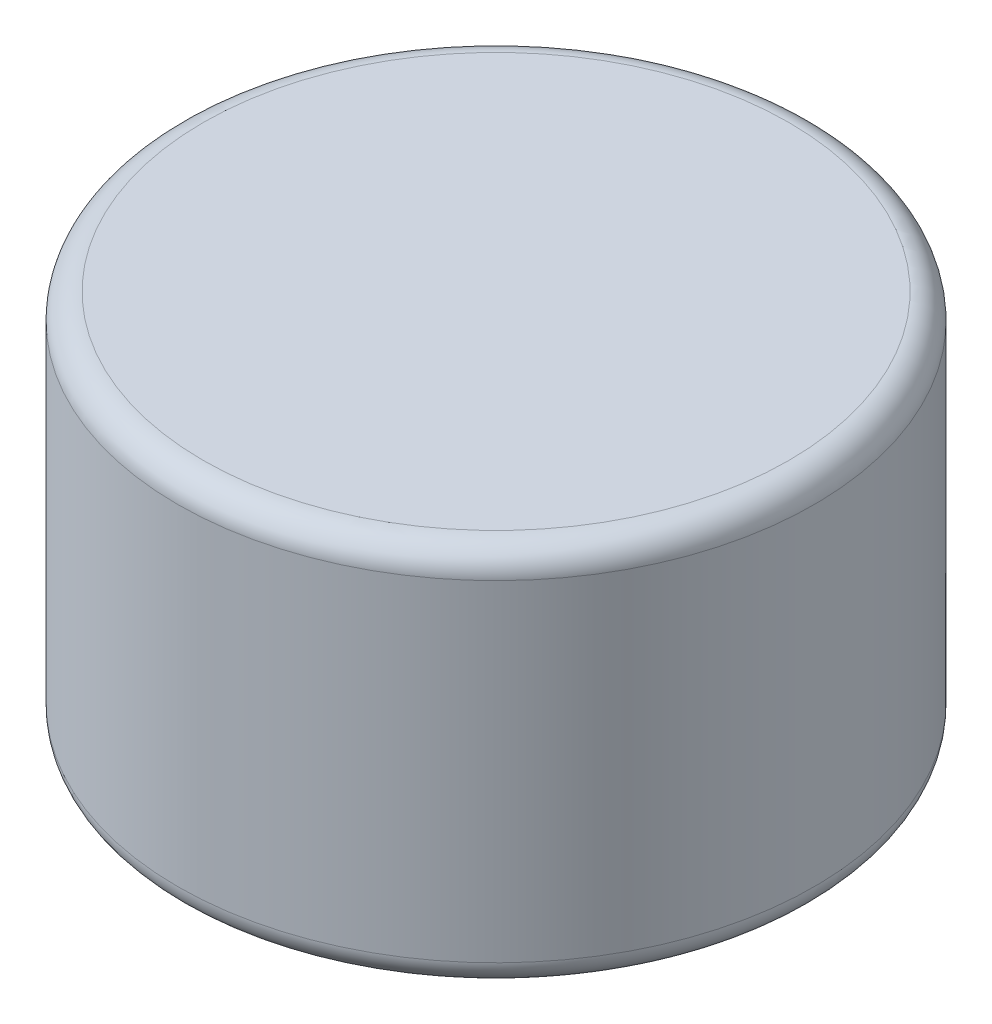
ISO-10303-21;
HEADER;
FILE_DESCRIPTION(('STEP AP214'),'2;1');
FILE_NAME('part.step','',(''),(''),'','','');
FILE_SCHEMA(('AUTOMOTIVE_DESIGN { 1 0 10303 214 1 1 1 1 }'));
ENDSEC;
DATA;
#1=APPLICATION_CONTEXT('core data for automotive mechanical design processes');
#2=APPLICATION_PROTOCOL_DEFINITION('international standard','automotive_design',2000,#1);
#3=PRODUCT_CONTEXT('',#1,'mechanical');
#4=PRODUCT('Part','Part','',(#3));
#5=PRODUCT_RELATED_PRODUCT_CATEGORY('part','',(#4));
#6=PRODUCT_DEFINITION_FORMATION('','',#4);
#7=PRODUCT_DEFINITION_CONTEXT('part definition',#1,'design');
#8=PRODUCT_DEFINITION('design','',#6,#7);
#9=PRODUCT_DEFINITION_SHAPE('','',#8);
#10=(LENGTH_UNIT() NAMED_UNIT(*) SI_UNIT(.MILLI.,.METRE.));
#11=(NAMED_UNIT(*) PLANE_ANGLE_UNIT() SI_UNIT($,.RADIAN.));
#12=(NAMED_UNIT(*) SI_UNIT($,.STERADIAN.) SOLID_ANGLE_UNIT());
#13=UNCERTAINTY_MEASURE_WITH_UNIT(LENGTH_MEASURE(1.E-05),#10,'distance_accuracy_value','');
#14=(GEOMETRIC_REPRESENTATION_CONTEXT(3) GLOBAL_UNCERTAINTY_ASSIGNED_CONTEXT((#13)) GLOBAL_UNIT_ASSIGNED_CONTEXT((#10,
#11,#12)) REPRESENTATION_CONTEXT('',''));
#15=CARTESIAN_POINT('',(0.,0.,0.));
#16=DIRECTION('',(0.,0.,1.));
#17=DIRECTION('',(1.,0.,0.));
#18=AXIS2_PLACEMENT_3D('',#15,#16,#17);
#19=CARTESIAN_POINT('',(0.,3.,0.));
#20=DIRECTION('',(0.,-1.,0.));
#21=DIRECTION('',(0.,0.,-1.));
#22=AXIS2_PLACEMENT_3D('',#19,#20,#21);
#23=CYLINDRICAL_SURFACE('',#22,2.5);
#24=CARTESIAN_POINT('',(0.,0.2,0.));
#25=DIRECTION('',(0.,1.,0.));
#26=DIRECTION('',(0.,0.,1.));
#27=AXIS2_PLACEMENT_3D('',#24,#25,#26);
#28=CIRCLE('',#27,2.5);
#29=CARTESIAN_POINT('',(0.,0.2,2.5));
#30=VERTEX_POINT('',#29);
#31=EDGE_CURVE('E46',#30,#30,#28,.T.);
#32=ORIENTED_EDGE('',*,*,#31,.T.);
#33=EDGE_LOOP('',(#32));
#34=FACE_BOUND('',#33,.T.);
#35=CARTESIAN_POINT('',(0.,2.8,0.));
#36=DIRECTION('',(0.,1.,0.));
#37=DIRECTION('',(0.,0.,1.));
#38=AXIS2_PLACEMENT_3D('',#35,#36,#37);
#39=CIRCLE('',#38,2.5);
#40=CARTESIAN_POINT('',(0.,2.8,2.5));
#41=VERTEX_POINT('',#40);
#42=EDGE_CURVE('E50',#41,#41,#39,.F.);
#43=ORIENTED_EDGE('',*,*,#42,.T.);
#44=EDGE_LOOP('',(#43));
#45=FACE_BOUND('',#44,.T.);
#46=ADVANCED_FACE('F35',(#34,#45),#23,.T.);
#47=CARTESIAN_POINT('',(0.,3.,0.));
#48=DIRECTION('',(0.,1.,0.));
#49=DIRECTION('',(0.,0.,1.));
#50=AXIS2_PLACEMENT_3D('',#47,#48,#49);
#51=PLANE('',#50);
#52=CARTESIAN_POINT('',(0.,3.,0.));
#53=DIRECTION('',(0.,1.,0.));
#54=DIRECTION('',(0.,0.,1.));
#55=AXIS2_PLACEMENT_3D('',#52,#53,#54);
#56=CIRCLE('',#55,2.3);
#57=CARTESIAN_POINT('',(0.,3.,2.3));
#58=VERTEX_POINT('',#57);
#59=EDGE_CURVE('E10',#58,#58,#56,.T.);
#60=ORIENTED_EDGE('',*,*,#59,.T.);
#61=EDGE_LOOP('',(#60));
#62=FACE_BOUND('',#61,.T.);
#63=ADVANCED_FACE('F66',(#62),#51,.T.);
#64=CARTESIAN_POINT('',(0.,0.,0.));
#65=DIRECTION('',(0.,1.,0.));
#66=DIRECTION('',(0.,0.,1.));
#67=AXIS2_PLACEMENT_3D('',#64,#65,#66);
#68=PLANE('',#67);
#69=CARTESIAN_POINT('',(0.,0.,0.));
#70=DIRECTION('',(0.,1.,0.));
#71=DIRECTION('',(0.,0.,1.));
#72=AXIS2_PLACEMENT_3D('',#69,#70,#71);
#73=CIRCLE('',#72,2.3);
#74=CARTESIAN_POINT('',(0.,0.,2.3));
#75=VERTEX_POINT('',#74);
#76=EDGE_CURVE('E42',#75,#75,#73,.F.);
#77=ORIENTED_EDGE('',*,*,#76,.T.);
#78=EDGE_LOOP('',(#77));
#79=FACE_BOUND('',#78,.T.);
#80=ADVANCED_FACE('F63',(#79),#68,.F.);
#81=CARTESIAN_POINT('',(0.,0.2,0.));
#82=DIRECTION('',(0.,1.,0.));
#83=DIRECTION('',(0.,0.,1.));
#84=AXIS2_PLACEMENT_3D('',#81,#82,#83);
#85=TOROIDAL_SURFACE('',#84,2.3,0.2);
#86=ORIENTED_EDGE('',*,*,#76,.F.);
#87=EDGE_LOOP('',(#86));
#88=FACE_BOUND('',#87,.T.);
#89=ORIENTED_EDGE('',*,*,#31,.F.);
#90=EDGE_LOOP('',(#89));
#91=FACE_BOUND('',#90,.T.);
#92=ADVANCED_FACE('F59',(#88,#91),#85,.T.);
#93=CARTESIAN_POINT('',(0.,2.8,0.));
#94=DIRECTION('',(0.,1.,0.));
#95=DIRECTION('',(0.,0.,1.));
#96=AXIS2_PLACEMENT_3D('',#93,#94,#95);
#97=TOROIDAL_SURFACE('',#96,2.3,0.2);
#98=ORIENTED_EDGE('',*,*,#42,.F.);
#99=EDGE_LOOP('',(#98));
#100=FACE_BOUND('',#99,.T.);
#101=ORIENTED_EDGE('',*,*,#59,.F.);
#102=EDGE_LOOP('',(#101));
#103=FACE_BOUND('',#102,.T.);
#104=ADVANCED_FACE('F37',(#100,#103),#97,.T.);
#105=CLOSED_SHELL('',(#46,#63,#80,#92,#104));
#106=MANIFOLD_SOLID_BREP('B2',#105);
#107=ADVANCED_BREP_SHAPE_REPRESENTATION('',(#18,#106),#14);
#108=SHAPE_DEFINITION_REPRESENTATION(#9,#107);
ENDSEC;
END-ISO-10303-21;
